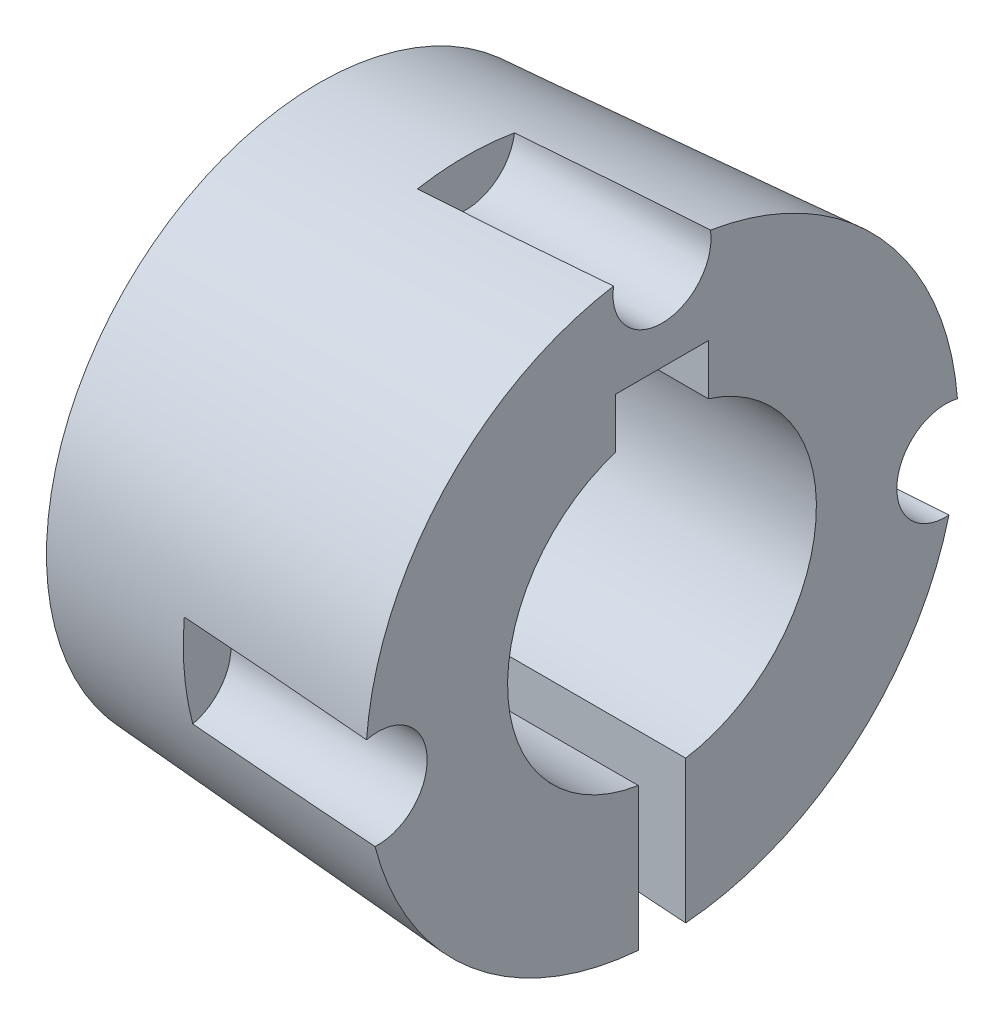
ISO-10303-21;
HEADER;
FILE_DESCRIPTION(('STEP AP214'),'2;1');
FILE_NAME('part.step','',(''),(''),'','','');
FILE_SCHEMA(('AUTOMOTIVE_DESIGN { 1 0 10303 214 1 1 1 1 }'));
ENDSEC;
DATA;
#1=APPLICATION_CONTEXT('core data for automotive mechanical design processes');
#2=APPLICATION_PROTOCOL_DEFINITION('international standard','automotive_design',2000,#1);
#3=PRODUCT_CONTEXT('',#1,'mechanical');
#4=PRODUCT('Part','Part','',(#3));
#5=PRODUCT_RELATED_PRODUCT_CATEGORY('part','',(#4));
#6=PRODUCT_DEFINITION_FORMATION('','',#4);
#7=PRODUCT_DEFINITION_CONTEXT('part definition',#1,'design');
#8=PRODUCT_DEFINITION('design','',#6,#7);
#9=PRODUCT_DEFINITION_SHAPE('','',#8);
#10=(LENGTH_UNIT() NAMED_UNIT(*) SI_UNIT(.MILLI.,.METRE.));
#11=(NAMED_UNIT(*) PLANE_ANGLE_UNIT() SI_UNIT($,.RADIAN.));
#12=(NAMED_UNIT(*) SI_UNIT($,.STERADIAN.) SOLID_ANGLE_UNIT());
#13=UNCERTAINTY_MEASURE_WITH_UNIT(LENGTH_MEASURE(1.E-05),#10,'distance_accuracy_value','');
#14=(GEOMETRIC_REPRESENTATION_CONTEXT(3) GLOBAL_UNCERTAINTY_ASSIGNED_CONTEXT((#13)) GLOBAL_UNIT_ASSIGNED_CONTEXT((#10,
#11,#12)) REPRESENTATION_CONTEXT('',''));
#15=CARTESIAN_POINT('',(0.,0.,0.));
#16=DIRECTION('',(0.,0.,1.));
#17=DIRECTION('',(1.,0.,0.));
#18=AXIS2_PLACEMENT_3D('',#15,#16,#17);
#19=CARTESIAN_POINT('',(22.225,9.59485,0.));
#20=DIRECTION('',(1.,0.,0.));
#21=DIRECTION('',(0.,-1.,0.));
#22=AXIS2_PLACEMENT_3D('',#19,#20,#21);
#23=PLANE('',#22);
#24=DIRECTION('',(0.,1.,0.));
#25=VECTOR('',#24,1.);
#26=CARTESIAN_POINT('',(22.225,-0.959485,1.535176));
#27=LINE('',#26,#25);
#28=CARTESIAN_POINT('',(22.225,-19.1281943930687,1.535176));
#29=VERTEX_POINT('',#28);
#30=CARTESIAN_POINT('',(22.225,-9.88145913562486,1.535176));
#31=VERTEX_POINT('',#30);
#32=EDGE_CURVE('E115',#29,#31,#27,.T.);
#33=ORIENTED_EDGE('',*,*,#32,.T.);
#34=CARTESIAN_POINT('',(22.225,0.,0.));
#35=DIRECTION('',(-1.,0.,0.));
#36=DIRECTION('',(0.,0.,-1.));
#37=AXIS2_PLACEMENT_3D('',#34,#35,#36);
#38=CIRCLE('',#37,10.);
#39=CARTESIAN_POINT('',(22.225,9.53939201416946,3.));
#40=VERTEX_POINT('',#39);
#41=EDGE_CURVE('E142',#31,#40,#38,.T.);
#42=ORIENTED_EDGE('',*,*,#41,.T.);
#43=DIRECTION('',(0.,1.,0.));
#44=VECTOR('',#43,1.);
#45=CARTESIAN_POINT('',(22.225,7.997425,3.));
#46=LINE('',#45,#44);
#47=CARTESIAN_POINT('',(22.225,12.8,3.));
#48=VERTEX_POINT('',#47);
#49=EDGE_CURVE('E132',#40,#48,#46,.T.);
#50=ORIENTED_EDGE('',*,*,#49,.T.);
#51=DIRECTION('',(0.,0.,-1.));
#52=VECTOR('',#51,1.);
#53=CARTESIAN_POINT('',(22.225,12.8,0.));
#54=LINE('',#53,#52);
#55=CARTESIAN_POINT('',(22.225,12.8,-3.));
#56=VERTEX_POINT('',#55);
#57=EDGE_CURVE('E9',#48,#56,#54,.T.);
#58=ORIENTED_EDGE('',*,*,#57,.T.);
#59=DIRECTION('',(0.,-1.,0.));
#60=VECTOR('',#59,1.);
#61=CARTESIAN_POINT('',(22.225,7.997425,-3.));
#62=LINE('',#61,#60);
#63=CARTESIAN_POINT('',(22.225,9.53939201416946,-3.));
#64=VERTEX_POINT('',#63);
#65=EDGE_CURVE('E134',#56,#64,#62,.T.);
#66=ORIENTED_EDGE('',*,*,#65,.T.);
#67=CARTESIAN_POINT('',(22.225,0.,0.));
#68=DIRECTION('',(-1.,0.,0.));
#69=DIRECTION('',(0.,0.,-1.));
#70=AXIS2_PLACEMENT_3D('',#67,#68,#69);
#71=CIRCLE('',#70,10.);
#72=CARTESIAN_POINT('',(22.225,-9.88145913562486,-1.535176));
#73=VERTEX_POINT('',#72);
#74=EDGE_CURVE('E145',#64,#73,#71,.T.);
#75=ORIENTED_EDGE('',*,*,#74,.T.);
#76=DIRECTION('',(0.,-1.,0.));
#77=VECTOR('',#76,1.);
#78=CARTESIAN_POINT('',(22.225,-0.959485,-1.535176));
#79=LINE('',#78,#77);
#80=CARTESIAN_POINT('',(22.225,-19.1281943930687,-1.535176));
#81=VERTEX_POINT('',#80);
#82=EDGE_CURVE('E126',#73,#81,#79,.T.);
#83=ORIENTED_EDGE('',*,*,#82,.T.);
#84=CARTESIAN_POINT('',(22.225,0.,0.));
#85=DIRECTION('',(-1.,0.,0.));
#86=DIRECTION('',(0.,1.,0.));
#87=AXIS2_PLACEMENT_3D('',#84,#85,#86);
#88=CIRCLE('',#87,19.1897);
#89=CARTESIAN_POINT('',(22.225,-4.77681167054719,-18.5856572752788));
#90=VERTEX_POINT('',#89);
#91=EDGE_CURVE('E185',#90,#81,#88,.T.);
#92=ORIENTED_EDGE('',*,*,#91,.F.);
#93=CARTESIAN_POINT('',(22.225,-1.60829363649681,-18.3828803833568));
#94=DIRECTION('',(-1.,0.,0.));
#95=DIRECTION('',(0.,-0.996194698091746,0.0871557427476582));
#96=AXIS2_PLACEMENT_3D('',#93,#94,#95);
#97=CIRCLE('',#96,3.175);
#98=CARTESIAN_POINT('',(22.225,1.47687565123978,-19.1327840211709));
#99=VERTEX_POINT('',#98);
#100=EDGE_CURVE('E221',#90,#99,#97,.T.);
#101=ORIENTED_EDGE('',*,*,#100,.T.);
#102=CARTESIAN_POINT('',(22.225,0.,0.));
#103=DIRECTION('',(-1.,0.,0.));
#104=DIRECTION('',(0.,1.,0.));
#105=AXIS2_PLACEMENT_3D('',#102,#103,#104);
#106=CIRCLE('',#105,19.1897);
#107=CARTESIAN_POINT('',(22.225,18.9312598072953,-3.13878769570155));
#108=VERTEX_POINT('',#107);
#109=EDGE_CURVE('E182',#108,#99,#106,.T.);
#110=ORIENTED_EDGE('',*,*,#109,.F.);
#111=CARTESIAN_POINT('',(22.225,18.4531,0.));
#112=DIRECTION('',(-1.,0.,0.));
#113=DIRECTION('',(0.,0.,-1.));
#114=AXIS2_PLACEMENT_3D('',#111,#112,#113);
#115=CIRCLE('',#114,3.175);
#116=CARTESIAN_POINT('',(22.225,18.9312598072953,3.13878769570155));
#117=VERTEX_POINT('',#116);
#118=EDGE_CURVE('E133',#108,#117,#115,.T.);
#119=ORIENTED_EDGE('',*,*,#118,.T.);
#120=CARTESIAN_POINT('',(22.225,0.,0.));
#121=DIRECTION('',(-1.,0.,0.));
#122=DIRECTION('',(0.,1.,0.));
#123=AXIS2_PLACEMENT_3D('',#120,#121,#122);
#124=CIRCLE('',#123,19.1897);
#125=CARTESIAN_POINT('',(22.225,1.47687565123978,19.1327840211709));
#126=VERTEX_POINT('',#125);
#127=EDGE_CURVE('E175',#126,#117,#124,.T.);
#128=ORIENTED_EDGE('',*,*,#127,.F.);
#129=CARTESIAN_POINT('',(22.225,-1.60829363649681,18.3828803833568));
#130=DIRECTION('',(-1.,0.,0.));
#131=DIRECTION('',(0.,0.996194698091746,0.0871557427476582));
#132=AXIS2_PLACEMENT_3D('',#129,#130,#131);
#133=CIRCLE('',#132,3.175);
#134=CARTESIAN_POINT('',(22.225,-4.77681167054719,18.5856572752788));
#135=VERTEX_POINT('',#134);
#136=EDGE_CURVE('E191',#126,#135,#133,.T.);
#137=ORIENTED_EDGE('',*,*,#136,.T.);
#138=CARTESIAN_POINT('',(22.225,0.,0.));
#139=DIRECTION('',(-1.,0.,0.));
#140=DIRECTION('',(0.,1.,0.));
#141=AXIS2_PLACEMENT_3D('',#138,#139,#140);
#142=CIRCLE('',#141,19.1897);
#143=EDGE_CURVE('E204',#29,#135,#142,.T.);
#144=ORIENTED_EDGE('',*,*,#143,.F.);
#145=EDGE_LOOP('',(#33,#42,#50,#58,#66,#75,#83,#92,#101,#110,#119,#128,#137,#144));
#146=FACE_BOUND('',#145,.T.);
#147=ADVANCED_FACE('F15',(#146),#23,.T.);
#148=CARTESIAN_POINT('',(11.1125,12.8,0.));
#149=DIRECTION('',(0.,-1.,0.));
#150=DIRECTION('',(0.,0.,-1.));
#151=AXIS2_PLACEMENT_3D('',#148,#149,#150);
#152=PLANE('',#151);
#153=DIRECTION('',(0.,0.,1.));
#154=VECTOR('',#153,1.);
#155=CARTESIAN_POINT('',(0.,12.8,0.));
#156=LINE('',#155,#154);
#157=CARTESIAN_POINT('',(0.,12.8,-3.));
#158=VERTEX_POINT('',#157);
#159=CARTESIAN_POINT('',(0.,12.8,3.));
#160=VERTEX_POINT('',#159);
#161=EDGE_CURVE('E152',#158,#160,#156,.T.);
#162=ORIENTED_EDGE('',*,*,#161,.F.);
#163=DIRECTION('',(1.,0.,0.));
#164=VECTOR('',#163,1.);
#165=CARTESIAN_POINT('',(11.1125,12.8,-3.));
#166=LINE('',#165,#164);
#167=EDGE_CURVE('E28',#158,#56,#166,.T.);
#168=ORIENTED_EDGE('',*,*,#167,.T.);
#169=ORIENTED_EDGE('',*,*,#57,.F.);
#170=DIRECTION('',(-1.,0.,0.));
#171=VECTOR('',#170,1.);
#172=CARTESIAN_POINT('',(11.1125,12.8,3.));
#173=LINE('',#172,#171);
#174=EDGE_CURVE('E127',#48,#160,#173,.T.);
#175=ORIENTED_EDGE('',*,*,#174,.T.);
#176=EDGE_LOOP('',(#162,#168,#169,#175));
#177=FACE_BOUND('',#176,.T.);
#178=ADVANCED_FACE('F360',(#177),#152,.T.);
#179=CARTESIAN_POINT('',(11.1125,6.4,-3.));
#180=DIRECTION('',(0.,0.,1.));
#181=DIRECTION('',(1.,0.,0.));
#182=AXIS2_PLACEMENT_3D('',#179,#180,#181);
#183=PLANE('',#182);
#184=DIRECTION('',(0.,1.,0.));
#185=VECTOR('',#184,1.);
#186=CARTESIAN_POINT('',(0.,7.60952557374426,-3.));
#187=LINE('',#186,#185);
#188=CARTESIAN_POINT('',(0.,9.53939201416946,-3.));
#189=VERTEX_POINT('',#188);
#190=EDGE_CURVE('E137',#189,#158,#187,.T.);
#191=ORIENTED_EDGE('',*,*,#190,.F.);
#192=DIRECTION('',(-1.,0.,0.));
#193=VECTOR('',#192,1.);
#194=CARTESIAN_POINT('',(11.1125,9.53939201416946,-3.));
#195=LINE('',#194,#193);
#196=EDGE_CURVE('E143',#64,#189,#195,.T.);
#197=ORIENTED_EDGE('',*,*,#196,.F.);
#198=ORIENTED_EDGE('',*,*,#65,.F.);
#199=ORIENTED_EDGE('',*,*,#167,.F.);
#200=EDGE_LOOP('',(#191,#197,#198,#199));
#201=FACE_BOUND('',#200,.T.);
#202=ADVANCED_FACE('F415',(#201),#183,.T.);
#203=CARTESIAN_POINT('',(11.1125,6.4,3.));
#204=DIRECTION('',(0.,0.,1.));
#205=DIRECTION('',(1.,0.,0.));
#206=AXIS2_PLACEMENT_3D('',#203,#204,#205);
#207=PLANE('',#206);
#208=DIRECTION('',(0.,-1.,0.));
#209=VECTOR('',#208,1.);
#210=CARTESIAN_POINT('',(0.,7.60952557374426,3.));
#211=LINE('',#210,#209);
#212=CARTESIAN_POINT('',(0.,9.53939201416946,3.));
#213=VERTEX_POINT('',#212);
#214=EDGE_CURVE('E146',#160,#213,#211,.T.);
#215=ORIENTED_EDGE('',*,*,#214,.F.);
#216=ORIENTED_EDGE('',*,*,#174,.F.);
#217=ORIENTED_EDGE('',*,*,#49,.F.);
#218=DIRECTION('',(1.,0.,0.));
#219=VECTOR('',#218,1.);
#220=CARTESIAN_POINT('',(11.1125,9.53939201416946,3.));
#221=LINE('',#220,#219);
#222=EDGE_CURVE('E139',#213,#40,#221,.T.);
#223=ORIENTED_EDGE('',*,*,#222,.F.);
#224=EDGE_LOOP('',(#215,#216,#217,#223));
#225=FACE_BOUND('',#224,.T.);
#226=ADVANCED_FACE('F257',(#225),#207,.F.);
#227=CARTESIAN_POINT('',(16.375,18.4531,0.));
#228=DIRECTION('',(-1.,0.,0.));
#229=DIRECTION('',(0.,0.,-1.));
#230=AXIS2_PLACEMENT_3D('',#227,#228,#229);
#231=CYLINDRICAL_SURFACE('',#230,3.175);
#232=CARTESIAN_POINT('',(22.2249990842214,18.9312663694617,3.13874772556863));
#233=CARTESIAN_POINT('',(21.6965128717116,18.8929039142587,3.14455795965913));
#234=CARTESIAN_POINT('',(21.1680111110432,18.8546480942142,3.14965156892552));
#235=CARTESIAN_POINT('',(20.110817453753,18.7783407807485,3.15843144485977));
#236=CARTESIAN_POINT('',(19.5821255487172,18.7402893539092,3.1621172774578));
#237=CARTESIAN_POINT('',(18.5245516279835,18.6643935701948,3.16810490022839));
#238=CARTESIAN_POINT('',(17.995669604871,18.6265492823395,3.1704062539587));
#239=CARTESIAN_POINT('',(16.9377154395597,18.5510693455787,3.17364806457086));
#240=CARTESIAN_POINT('',(16.4086432909538,18.5134337677394,3.17458808323553));
#241=CARTESIAN_POINT('',(15.3503088758068,18.4383720006973,3.17513025511628));
#242=CARTESIAN_POINT('',(14.8210466038835,18.4009458843075,3.17473196892807));
#243=CARTESIAN_POINT('',(13.7623319385705,18.3263028869355,3.17262043290532));
#244=CARTESIAN_POINT('',(13.2328795408319,18.2890860801693,3.17090674304027));
#245=CARTESIAN_POINT('',(12.1737846294268,18.2148607661589,3.16618718775157));
#246=CARTESIAN_POINT('',(11.6441421124536,18.1778523342146,3.1631808822157));
#247=CARTESIAN_POINT('',(10.5846669364506,18.104041794008,3.15589872208468));
#248=CARTESIAN_POINT('',(10.0548342751476,18.0672397617076,3.15162242780242));
#249=CARTESIAN_POINT('',(9.52499991031494,18.0305463707409,3.14672354499309));
#250=B_SPLINE_CURVE_WITH_KNOTS('',3,(#232,#233,#234,#235,#236,#237,#238,#239,#240,#241,#242,
#243,#244,#245,#246,#247,#248,#249),.UNSPECIFIED.,.F.,.F.,(4,2,2,2,2,2,2,2,4),(0.,
1.5897251702087,3.17994011676524,4.77065609934622,6.36188402365459,7.95363444524772,
9.54591757338986,11.1387432749278,12.7321210781888),.UNSPECIFIED.);
#251=CARTESIAN_POINT('',(9.525,18.0305408396218,3.14675527424369));
#252=VERTEX_POINT('',#251);
#253=EDGE_CURVE('E178',#117,#252,#250,.T.);
#254=ORIENTED_EDGE('',*,*,#253,.F.);
#255=ORIENTED_EDGE('',*,*,#118,.F.);
#256=CARTESIAN_POINT('',(9.52499991031494,18.0305463707409,-3.14672354499308));
#257=CARTESIAN_POINT('',(10.0548342751476,18.0672397617076,-3.15162242780242));
#258=CARTESIAN_POINT('',(10.5846669364506,18.104041794008,-3.15589872208468));
#259=CARTESIAN_POINT('',(11.6441421124535,18.1778523342145,-3.16318088221571));
#260=CARTESIAN_POINT('',(12.1737846294267,18.2148607661589,-3.16618718775157));
#261=CARTESIAN_POINT('',(13.2328795408318,18.2890860801693,-3.17090674304027));
#262=CARTESIAN_POINT('',(13.7623319385704,18.3263028869355,-3.17262043290533));
#263=CARTESIAN_POINT('',(14.8210466038834,18.4009458843075,-3.17473196892808));
#264=CARTESIAN_POINT('',(15.3503088758067,18.4383720006973,-3.17513025511628));
#265=CARTESIAN_POINT('',(16.4086432909537,18.5134337677394,-3.17458808323554));
#266=CARTESIAN_POINT('',(16.9377154395596,18.5510693455787,-3.17364806457086));
#267=CARTESIAN_POINT('',(17.9956696048709,18.6265492823395,-3.1704062539587));
#268=CARTESIAN_POINT('',(18.5245516279834,18.6643935701948,-3.16810490022839));
#269=CARTESIAN_POINT('',(19.5821255487171,18.7402893539092,-3.16211727745779));
#270=CARTESIAN_POINT('',(20.110817453753,18.7783407807485,-3.15843144485975));
#271=CARTESIAN_POINT('',(21.1680111110432,18.8546480942142,-3.14965156892549));
#272=CARTESIAN_POINT('',(21.6965128717116,18.8929039142587,-3.14455795965909));
#273=CARTESIAN_POINT('',(22.2249990842214,18.9312663694617,-3.1387477255686));
#274=B_SPLINE_CURVE_WITH_KNOTS('',3,(#256,#257,#258,#259,#260,#261,#262,#263,#264,#265,#266,
#267,#268,#269,#270,#271,#272,#273),.UNSPECIFIED.,.F.,.F.,(4,2,2,2,2,2,2,2,4),(0.,
1.59337780326089,3.18620350479883,4.77848663294095,6.37023705453407,7.96146497884245,
9.55218096142345,11.14239590798,12.7321210781888),.UNSPECIFIED.);
#275=CARTESIAN_POINT('',(9.525,18.0305408396218,-3.14675527424369));
#276=VERTEX_POINT('',#275);
#277=EDGE_CURVE('E186',#276,#108,#274,.T.);
#278=ORIENTED_EDGE('',*,*,#277,.F.);
#279=CARTESIAN_POINT('',(9.525,18.4531,0.));
#280=DIRECTION('',(-1.,0.,0.));
#281=DIRECTION('',(0.,0.,-1.));
#282=AXIS2_PLACEMENT_3D('',#279,#280,#281);
#283=CIRCLE('',#282,3.175);
#284=EDGE_CURVE('E172',#276,#252,#283,.T.);
#285=ORIENTED_EDGE('',*,*,#284,.T.);
#286=EDGE_LOOP('',(#254,#255,#278,#285));
#287=FACE_BOUND('',#286,.T.);
#288=ADVANCED_FACE('F246',(#287),#231,.F.);
#289=CARTESIAN_POINT('',(9.525,18.4531,0.));
#290=DIRECTION('',(-1.,0.,0.));
#291=DIRECTION('',(0.,0.,1.));
#292=AXIS2_PLACEMENT_3D('',#289,#290,#291);
#293=PLANE('',#292);
#294=CARTESIAN_POINT('',(9.525,0.,0.));
#295=DIRECTION('',(-1.,0.,0.));
#296=DIRECTION('',(0.,1.,0.));
#297=AXIS2_PLACEMENT_3D('',#294,#295,#296);
#298=CIRCLE('',#297,18.3030727399869);
#299=EDGE_CURVE('E194',#252,#276,#298,.T.);
#300=ORIENTED_EDGE('',*,*,#299,.F.);
#301=ORIENTED_EDGE('',*,*,#284,.F.);
#302=EDGE_LOOP('',(#300,#301));
#303=FACE_BOUND('',#302,.T.);
#304=ADVANCED_FACE('F256',(#303),#293,.F.);
#305=CARTESIAN_POINT('',(16.375,-1.60829363649681,18.3828803833568));
#306=DIRECTION('',(-1.,0.,0.));
#307=DIRECTION('',(0.,0.996194698091746,0.0871557427476582));
#308=AXIS2_PLACEMENT_3D('',#305,#306,#307);
#309=CYLINDRICAL_SURFACE('',#308,3.175);
#310=CARTESIAN_POINT('',(22.224999083807,-4.77677240666845,18.5856673006393));
#311=CARTESIAN_POINT('',(21.6965126218974,-4.77921701984449,18.5469444136844));
#312=CARTESIAN_POINT('',(21.168010611849,-4.78095702968703,18.5083902139069));
#313=CARTESIAN_POINT('',(20.1108165270524,-4.78305287102237,18.431608026402));
#314=CARTESIAN_POINT('',(19.5821244438938,-4.78340827608722,18.3933801427891));
#315=CARTESIAN_POINT('',(18.5245502381681,-4.78275835851104,18.3172512897642));
#316=CARTESIAN_POINT('',(17.9956681081893,-4.7817526072878,18.2793504271021));
#317=CARTESIAN_POINT('',(16.9377138003996,-4.77840357141758,18.2038751617185));
#318=CARTESIAN_POINT('',(16.4086416161842,-4.77605985659523,18.1663008679402));
#319=CARTESIAN_POINT('',(15.3503072010726,-4.77005790265254,18.0914774798347));
#320=CARTESIAN_POINT('',(14.8210449647963,-4.76639923232316,18.0542284962944));
#321=CARTESIAN_POINT('',(13.7623304420325,-4.75779016868792,17.9800535799917));
#322=CARTESIAN_POINT('',(13.2328781511978,-4.75283934366817,17.9431277594688));
#323=CARTESIAN_POINT('',(12.1737835248556,-4.74166859047176,17.8695962507612));
#324=CARTESIAN_POINT('',(11.6441411860428,-4.73544823059099,17.8329906759032));
#325=CARTESIAN_POINT('',(10.5846664376171,-4.72176077587834,17.7600957181726));
#326=CARTESIAN_POINT('',(10.0548340257317,-4.71429324982028,17.7238064492497));
#327=CARTESIAN_POINT('',(9.52499991031484,-4.70621497294034,17.6876796704521));
#328=B_SPLINE_CURVE_WITH_KNOTS('',3,(#310,#311,#312,#313,#314,#315,#316,#317,#318,#319,#320,
#321,#322,#323,#324,#325,#326,#327),.UNSPECIFIED.,.F.,.F.,(4,2,2,2,2,2,2,2,4),(0.,
1.58972592013486,3.17994140236498,4.7706577063495,6.36188573777791,7.95363605219798,
9.54591885886816,11.1387440246332,12.7321210778216),.UNSPECIFIED.);
#329=CARTESIAN_POINT('',(9.525,-4.70624609941303,17.6876713949862));
#330=VERTEX_POINT('',#329);
#331=EDGE_CURVE('E206',#135,#330,#328,.T.);
#332=ORIENTED_EDGE('',*,*,#331,.F.);
#333=ORIENTED_EDGE('',*,*,#136,.F.);
#334=CARTESIAN_POINT('',(9.52499991031484,1.56328365076338,18.2361897260175));
#335=CARTESIAN_POINT('',(10.0548340257317,1.56496585116255,18.2731704359277));
#336=CARTESIAN_POINT('',(10.5846664376171,1.56601836330302,18.3102051116057));
#337=CARTESIAN_POINT('',(11.6441411860428,1.56683979825201,18.3843694327021));
#338=CARTESIAN_POINT('',(12.1737835248557,1.56660916552258,18.4214990407834));
#339=CARTESIAN_POINT('',(13.2328781511979,1.56484159738921,18.4958532215851));
#340=CARTESIAN_POINT('',(13.7623304420326,1.56330510680982,18.533077757665));
#341=CARTESIAN_POINT('',(14.8210449647964,1.55890304037942,18.6076207385307));
#342=CARTESIAN_POINT('',(15.3503072010726,1.55603790917379,18.6449391477483));
#343=CARTESIAN_POINT('',(16.4086416161842,1.54895573495838,18.7196680288259));
#344=CARTESIAN_POINT('',(16.9377138003996,1.54473913584455,18.7570784664606));
#345=CARTESIAN_POINT('',(17.9956681081893,1.53493115004186,18.8319886469468));
#346=CARTESIAN_POINT('',(18.5245502381681,1.52934020591084,18.8694883572094));
#347=CARTESIAN_POINT('',(19.5821244438939,1.51676061318303,18.944573498899));
#348=CARTESIAN_POINT('',(20.1108165270524,1.50977240519426,18.9821588996204));
#349=CARTESIAN_POINT('',(21.168010611849,1.49437531746062,19.0574106541399));
#350=CARTESIAN_POINT('',(21.6965126218974,1.48596687574461,19.0950769794536));
#351=CARTESIAN_POINT('',(22.224999083807,1.476835242982,19.1327870761227));
#352=B_SPLINE_CURVE_WITH_KNOTS('',3,(#334,#335,#336,#337,#338,#339,#340,#341,#342,#343,#344,
#345,#346,#347,#348,#349,#350,#351),.UNSPECIFIED.,.F.,.F.,(4,2,2,2,2,2,2,2,4),(0.,
1.59337705318845,3.18620221895346,4.77848502562364,6.37023534004371,7.96146337147212,
9.55217967545664,11.1423951576867,12.7321210778216),.UNSPECIFIED.);
#353=CARTESIAN_POINT('',(9.525,1.56331574137458,18.2361869813297));
#354=VERTEX_POINT('',#353);
#355=EDGE_CURVE('E179',#354,#126,#352,.T.);
#356=ORIENTED_EDGE('',*,*,#355,.F.);
#357=CARTESIAN_POINT('',(9.525,-1.60829363649681,18.3828803833568));
#358=DIRECTION('',(-1.,0.,0.));
#359=DIRECTION('',(0.,0.996194698091746,0.0871557427476582));
#360=AXIS2_PLACEMENT_3D('',#357,#358,#359);
#361=CIRCLE('',#360,3.175);
#362=EDGE_CURVE('E201',#354,#330,#361,.T.);
#363=ORIENTED_EDGE('',*,*,#362,.T.);
#364=EDGE_LOOP('',(#332,#333,#356,#363));
#365=FACE_BOUND('',#364,.T.);
#366=ADVANCED_FACE('F292',(#365),#309,.F.);
#367=CARTESIAN_POINT('',(9.525,-1.60829363649681,18.3828803833568));
#368=DIRECTION('',(-1.,0.,0.));
#369=DIRECTION('',(0.,-0.996194698091746,-0.0871557427476582));
#370=AXIS2_PLACEMENT_3D('',#367,#368,#369);
#371=PLANE('',#370);
#372=CARTESIAN_POINT('',(9.525,0.,0.));
#373=DIRECTION('',(-1.,0.,0.));
#374=DIRECTION('',(0.,1.,0.));
#375=AXIS2_PLACEMENT_3D('',#372,#373,#374);
#376=CIRCLE('',#375,18.3030727399869);
#377=EDGE_CURVE('E213',#330,#354,#376,.T.);
#378=ORIENTED_EDGE('',*,*,#377,.F.);
#379=ORIENTED_EDGE('',*,*,#362,.F.);
#380=EDGE_LOOP('',(#378,#379));
#381=FACE_BOUND('',#380,.T.);
#382=ADVANCED_FACE('F302',(#381),#371,.F.);
#383=CARTESIAN_POINT('',(11.1125,0.,0.));
#384=DIRECTION('',(1.,0.,0.));
#385=DIRECTION('',(0.,1.,0.));
#386=AXIS2_PLACEMENT_3D('',#383,#384,#385);
#387=CONICAL_SURFACE('',#386,18.4139011474885,0.0697000802996132);
#388=CARTESIAN_POINT('',(0.,-17.5711663590411,1.535176));
#389=CARTESIAN_POINT('',(10.641160729511,-18.3168895142304,1.535176));
#390=CARTESIAN_POINT('',(22.2252706108045,-19.1282133460135,1.535176));
#391=(BOUNDED_CURVE() B_SPLINE_CURVE(2,(#388,#389,#390),.UNSPECIFIED.,.F.,
.F.) B_SPLINE_CURVE_WITH_KNOTS((3,3),(0.,22.2797452655061),
.UNSPECIFIED.) CURVE() GEOMETRIC_REPRESENTATION_ITEM() RATIONAL_B_SPLINE_CURVE((1.,
1.00089494617182,1.)) REPRESENTATION_ITEM(''));
#392=CARTESIAN_POINT('',(0.,-17.5711663590411,1.535176));
#393=VERTEX_POINT('',#392);
#394=EDGE_CURVE('E91',#393,#29,#391,.T.);
#395=ORIENTED_EDGE('',*,*,#394,.T.);
#396=ORIENTED_EDGE('',*,*,#143,.T.);
#397=ORIENTED_EDGE('',*,*,#331,.T.);
#398=ORIENTED_EDGE('',*,*,#377,.T.);
#399=ORIENTED_EDGE('',*,*,#355,.T.);
#400=ORIENTED_EDGE('',*,*,#127,.T.);
#401=ORIENTED_EDGE('',*,*,#253,.T.);
#402=ORIENTED_EDGE('',*,*,#299,.T.);
#403=ORIENTED_EDGE('',*,*,#277,.T.);
#404=ORIENTED_EDGE('',*,*,#109,.T.);
#405=CARTESIAN_POINT('',(22.224999083807,1.47683524298161,-19.1327870761228));
#406=CARTESIAN_POINT('',(21.6965126218914,1.48596687574423,-19.0950769794532));
#407=CARTESIAN_POINT('',(21.1680106118368,1.49437531746026,-19.0574106541391));
#408=CARTESIAN_POINT('',(20.1108165270298,1.50977240519392,-18.9821588996188));
#409=CARTESIAN_POINT('',(19.5821244438669,1.5167606131827,-18.9445734988971));
#410=CARTESIAN_POINT('',(18.5245502381343,1.52934020591055,-18.8694883572071));
#411=CARTESIAN_POINT('',(17.9956681081529,1.53493115004159,-18.8319886469443));
#412=CARTESIAN_POINT('',(16.9377138003597,1.54473913584431,-18.7570784664578));
#413=CARTESIAN_POINT('',(16.4086416161434,1.54895573495815,-18.719668028823));
#414=CARTESIAN_POINT('',(15.3503072010318,1.55603790917359,-18.6449391477455));
#415=CARTESIAN_POINT('',(14.8210449647564,1.55890304037922,-18.6076207385279));
#416=CARTESIAN_POINT('',(13.7623304419961,1.56330510680966,-18.5330777576625));
#417=CARTESIAN_POINT('',(13.232878151164,1.56484159738907,-18.4958532215827));
#418=CARTESIAN_POINT('',(12.1737835248287,1.56660916552247,-18.4214990407815));
#419=CARTESIAN_POINT('',(11.6441411860202,1.56683979825192,-18.3843694327005));
#420=CARTESIAN_POINT('',(10.5846664376049,1.56601836330295,-18.3102051116049));
#421=CARTESIAN_POINT('',(10.0548340257256,1.5649658511625,-18.2731704359273));
#422=CARTESIAN_POINT('',(9.52499991031484,1.56328365076337,-18.2361897260175));
#423=B_SPLINE_CURVE_WITH_KNOTS('',3,(#405,#406,#407,#408,#409,#410,#411,#412,#413,#414,#415,
#416,#417,#418,#419,#420,#421,#422),.UNSPECIFIED.,.F.,.F.,(4,2,2,2,2,2,2,2,4),(0.,
1.58972592015313,3.17994140239629,4.77065770638865,6.36188573781966,7.95363605223712,
9.54591885889948,11.1387440246514,12.7321210778216),.UNSPECIFIED.);
#424=CARTESIAN_POINT('',(9.525,1.56331574137458,-18.2361869813297));
#425=VERTEX_POINT('',#424);
#426=EDGE_CURVE('E224',#99,#425,#423,.T.);
#427=ORIENTED_EDGE('',*,*,#426,.T.);
#428=CARTESIAN_POINT('',(9.525,0.,0.));
#429=DIRECTION('',(-1.,0.,0.));
#430=DIRECTION('',(0.,1.,0.));
#431=AXIS2_PLACEMENT_3D('',#428,#429,#430);
#432=CIRCLE('',#431,18.3030727399869);
#433=CARTESIAN_POINT('',(9.525,-4.70624609941303,-17.6876713949862));
#434=VERTEX_POINT('',#433);
#435=EDGE_CURVE('E163',#425,#434,#432,.T.);
#436=ORIENTED_EDGE('',*,*,#435,.T.);
#437=CARTESIAN_POINT('',(9.52499991031484,-4.70621497294038,-17.6876796704521));
#438=CARTESIAN_POINT('',(10.0548340257256,-4.71429324982022,-17.7238064492493));
#439=CARTESIAN_POINT('',(10.5846664376048,-4.72176077587817,-17.7600957181717));
#440=CARTESIAN_POINT('',(11.6441411860201,-4.73544823059067,-17.8329906759017));
#441=CARTESIAN_POINT('',(12.1737835248285,-4.74166859047136,-17.8695962507593));
#442=CARTESIAN_POINT('',(13.2328781511637,-4.75283934366764,-17.9431277594665));
#443=CARTESIAN_POINT('',(13.7623304419958,-4.75779016868733,-17.9800535799892));
#444=CARTESIAN_POINT('',(14.8210449647561,-4.76639923232249,-18.0542284962917));
#445=CARTESIAN_POINT('',(15.3503072010315,-4.77005790265185,-18.0914774798319));
#446=CARTESIAN_POINT('',(16.4086416161431,-4.7760598565945,-18.1663008679374));
#447=CARTESIAN_POINT('',(16.9377138003593,-4.77840357141683,-18.2038751617158));
#448=CARTESIAN_POINT('',(17.9956681081526,-4.78175260728704,-18.2793504270997));
#449=CARTESIAN_POINT('',(18.524550238134,-4.78275835851029,-18.317251289762));
#450=CARTESIAN_POINT('',(19.5821244438667,-4.78340827608652,-18.3933801427874));
#451=CARTESIAN_POINT('',(20.1108165270296,-4.78305287102172,-18.4316080264006));
#452=CARTESIAN_POINT('',(21.1680106118367,-4.78095702968649,-18.5083902139062));
#453=CARTESIAN_POINT('',(21.6965126218913,-4.77921701984401,-18.5469444136841));
#454=CARTESIAN_POINT('',(22.224999083807,-4.77677240666801,-18.5856673006394));
#455=B_SPLINE_CURVE_WITH_KNOTS('',3,(#437,#438,#439,#440,#441,#442,#443,#444,#445,#446,#447,
#448,#449,#450,#451,#452,#453,#454),.UNSPECIFIED.,.F.,.F.,(4,2,2,2,2,2,2,2,4),(0.,
1.59337705317002,3.18620221892187,4.77848502558416,6.3702353400016,7.96146337143264,
9.55217967542506,11.1423951576683,12.7321210778216),.UNSPECIFIED.);
#456=EDGE_CURVE('E207',#434,#90,#455,.T.);
#457=ORIENTED_EDGE('',*,*,#456,.T.);
#458=ORIENTED_EDGE('',*,*,#91,.T.);
#459=CARTESIAN_POINT('',(22.2252706108045,-19.1282133460135,-1.535176));
#460=CARTESIAN_POINT('',(10.641160729511,-18.3168895142304,-1.535176));
#461=CARTESIAN_POINT('',(0.,-17.5711663590411,-1.535176));
#462=(BOUNDED_CURVE() B_SPLINE_CURVE(2,(#459,#460,#461),.UNSPECIFIED.,.F.,
.F.) B_SPLINE_CURVE_WITH_KNOTS((3,3),(0.,22.2797452655061),
.UNSPECIFIED.) CURVE() GEOMETRIC_REPRESENTATION_ITEM() RATIONAL_B_SPLINE_CURVE((1.,
1.00089494617544,1.)) REPRESENTATION_ITEM(''));
#463=CARTESIAN_POINT('',(0.,-17.5711663590411,-1.535176));
#464=VERTEX_POINT('',#463);
#465=EDGE_CURVE('E93',#81,#464,#462,.T.);
#466=ORIENTED_EDGE('',*,*,#465,.T.);
#467=CARTESIAN_POINT('',(0.,0.,0.));
#468=DIRECTION('',(-1.,0.,0.));
#469=DIRECTION('',(0.,1.,0.));
#470=AXIS2_PLACEMENT_3D('',#467,#468,#469);
#471=CIRCLE('',#470,17.638102294977);
#472=EDGE_CURVE('E87',#393,#464,#471,.T.);
#473=ORIENTED_EDGE('',*,*,#472,.F.);
#474=EDGE_LOOP('',(#395,#396,#397,#398,#399,#400,#401,#402,#403,#404,#427,#436,#457,#458,#466,#473));
#475=FACE_BOUND('',#474,.T.);
#476=ADVANCED_FACE('F17',(#475),#387,.T.);
#477=CARTESIAN_POINT('',(16.375,-1.60829363649681,-18.3828803833568));
#478=DIRECTION('',(-1.,0.,0.));
#479=DIRECTION('',(0.,-0.996194698091746,0.0871557427476582));
#480=AXIS2_PLACEMENT_3D('',#477,#478,#479);
#481=CYLINDRICAL_SURFACE('',#480,3.175);
#482=ORIENTED_EDGE('',*,*,#426,.F.);
#483=ORIENTED_EDGE('',*,*,#100,.F.);
#484=ORIENTED_EDGE('',*,*,#456,.F.);
#485=CARTESIAN_POINT('',(9.525,-1.60829363649681,-18.3828803833568));
#486=DIRECTION('',(-1.,0.,0.));
#487=DIRECTION('',(0.,-0.996194698091746,0.0871557427476582));
#488=AXIS2_PLACEMENT_3D('',#485,#486,#487);
#489=CIRCLE('',#488,3.175);
#490=EDGE_CURVE('E313',#434,#425,#489,.T.);
#491=ORIENTED_EDGE('',*,*,#490,.T.);
#492=EDGE_LOOP('',(#482,#483,#484,#491));
#493=FACE_BOUND('',#492,.T.);
#494=ADVANCED_FACE('F348',(#493),#481,.F.);
#495=CARTESIAN_POINT('',(9.525,-1.60829363649681,-18.3828803833568));
#496=DIRECTION('',(-1.,0.,0.));
#497=DIRECTION('',(0.,0.996194698091746,-0.0871557427476582));
#498=AXIS2_PLACEMENT_3D('',#495,#496,#497);
#499=PLANE('',#498);
#500=ORIENTED_EDGE('',*,*,#435,.F.);
#501=ORIENTED_EDGE('',*,*,#490,.F.);
#502=EDGE_LOOP('',(#500,#501));
#503=FACE_BOUND('',#502,.T.);
#504=ADVANCED_FACE('F357',(#503),#499,.F.);
#505=CARTESIAN_POINT('',(11.1125,0.,0.));
#506=DIRECTION('',(-1.,0.,0.));
#507=DIRECTION('',(0.,0.,-1.));
#508=AXIS2_PLACEMENT_3D('',#505,#506,#507);
#509=CYLINDRICAL_SURFACE('',#508,10.);
#510=DIRECTION('',(-1.,0.,0.));
#511=VECTOR('',#510,1.);
#512=CARTESIAN_POINT('',(11.1125,-9.88145913562486,1.535176));
#513=LINE('',#512,#511);
#514=CARTESIAN_POINT('',(0.,-9.88145913562486,1.535176));
#515=VERTEX_POINT('',#514);
#516=EDGE_CURVE('E110',#31,#515,#513,.T.);
#517=ORIENTED_EDGE('',*,*,#516,.T.);
#518=CARTESIAN_POINT('',(0.,0.,0.));
#519=DIRECTION('',(1.,0.,0.));
#520=DIRECTION('',(0.,0.,-1.));
#521=AXIS2_PLACEMENT_3D('',#518,#519,#520);
#522=CIRCLE('',#521,10.);
#523=EDGE_CURVE('E106',#213,#515,#522,.T.);
#524=ORIENTED_EDGE('',*,*,#523,.F.);
#525=ORIENTED_EDGE('',*,*,#222,.T.);
#526=ORIENTED_EDGE('',*,*,#41,.F.);
#527=EDGE_LOOP('',(#517,#524,#525,#526));
#528=FACE_BOUND('',#527,.T.);
#529=ADVANCED_FACE('F258',(#528),#509,.F.);
#530=CARTESIAN_POINT('',(11.1125,0.,0.));
#531=DIRECTION('',(-1.,0.,0.));
#532=DIRECTION('',(0.,0.,-1.));
#533=AXIS2_PLACEMENT_3D('',#530,#531,#532);
#534=CYLINDRICAL_SURFACE('',#533,10.);
#535=DIRECTION('',(1.,0.,0.));
#536=VECTOR('',#535,1.);
#537=CARTESIAN_POINT('',(11.1125,-9.88145913562486,-1.535176));
#538=LINE('',#537,#536);
#539=CARTESIAN_POINT('',(0.,-9.88145913562486,-1.535176));
#540=VERTEX_POINT('',#539);
#541=EDGE_CURVE('E157',#540,#73,#538,.T.);
#542=ORIENTED_EDGE('',*,*,#541,.T.);
#543=ORIENTED_EDGE('',*,*,#74,.F.);
#544=ORIENTED_EDGE('',*,*,#196,.T.);
#545=CARTESIAN_POINT('',(0.,0.,0.));
#546=DIRECTION('',(1.,0.,0.));
#547=DIRECTION('',(0.,0.,-1.));
#548=AXIS2_PLACEMENT_3D('',#545,#546,#547);
#549=CIRCLE('',#548,10.);
#550=EDGE_CURVE('E97',#540,#189,#549,.T.);
#551=ORIENTED_EDGE('',*,*,#550,.F.);
#552=EDGE_LOOP('',(#542,#543,#544,#551));
#553=FACE_BOUND('',#552,.T.);
#554=ADVANCED_FACE('F303',(#553),#534,.F.);
#555=CARTESIAN_POINT('',(0.,8.81905114748852,0.));
#556=DIRECTION('',(-1.,0.,0.));
#557=DIRECTION('',(0.,1.,0.));
#558=AXIS2_PLACEMENT_3D('',#555,#556,#557);
#559=PLANE('',#558);
#560=DIRECTION('',(0.,-1.,0.));
#561=VECTOR('',#560,1.);
#562=CARTESIAN_POINT('',(0.,-1.34738442625574,1.535176));
#563=LINE('',#562,#561);
#564=EDGE_CURVE('E102',#515,#393,#563,.T.);
#565=ORIENTED_EDGE('',*,*,#564,.T.);
#566=ORIENTED_EDGE('',*,*,#472,.T.);
#567=DIRECTION('',(0.,1.,0.));
#568=VECTOR('',#567,1.);
#569=CARTESIAN_POINT('',(0.,-1.34738442625574,-1.535176));
#570=LINE('',#569,#568);
#571=EDGE_CURVE('E98',#464,#540,#570,.T.);
#572=ORIENTED_EDGE('',*,*,#571,.T.);
#573=ORIENTED_EDGE('',*,*,#550,.T.);
#574=ORIENTED_EDGE('',*,*,#190,.T.);
#575=ORIENTED_EDGE('',*,*,#161,.T.);
#576=ORIENTED_EDGE('',*,*,#214,.T.);
#577=ORIENTED_EDGE('',*,*,#523,.T.);
#578=EDGE_LOOP('',(#565,#566,#572,#573,#574,#575,#576,#577));
#579=FACE_BOUND('',#578,.T.);
#580=ADVANCED_FACE('F103',(#579),#559,.T.);
#581=CARTESIAN_POINT('',(11.1125,-11.51382,-1.535176));
#582=DIRECTION('',(0.,0.,1.));
#583=DIRECTION('',(1.,0.,0.));
#584=AXIS2_PLACEMENT_3D('',#581,#582,#583);
#585=PLANE('',#584);
#586=ORIENTED_EDGE('',*,*,#465,.F.);
#587=ORIENTED_EDGE('',*,*,#82,.F.);
#588=ORIENTED_EDGE('',*,*,#541,.F.);
#589=ORIENTED_EDGE('',*,*,#571,.F.);
#590=EDGE_LOOP('',(#586,#587,#588,#589));
#591=FACE_BOUND('',#590,.T.);
#592=ADVANCED_FACE('F402',(#591),#585,.T.);
#593=CARTESIAN_POINT('',(11.1125,-11.51382,1.535176));
#594=DIRECTION('',(0.,0.,1.));
#595=DIRECTION('',(1.,0.,0.));
#596=AXIS2_PLACEMENT_3D('',#593,#594,#595);
#597=PLANE('',#596);
#598=ORIENTED_EDGE('',*,*,#394,.F.);
#599=ORIENTED_EDGE('',*,*,#564,.F.);
#600=ORIENTED_EDGE('',*,*,#516,.F.);
#601=ORIENTED_EDGE('',*,*,#32,.F.);
#602=EDGE_LOOP('',(#598,#599,#600,#601));
#603=FACE_BOUND('',#602,.T.);
#604=ADVANCED_FACE('F113',(#603),#597,.F.);
#605=CLOSED_SHELL('',(#147,#178,#202,#226,#288,#304,#366,#382,#476,#494,#504,#529,#554,#580,
#592,#604));
#606=MANIFOLD_SOLID_BREP('B1',#605);
#607=ADVANCED_BREP_SHAPE_REPRESENTATION('',(#18,#606),#14);
#608=SHAPE_DEFINITION_REPRESENTATION(#9,#607);
ENDSEC;
END-ISO-10303-21;
